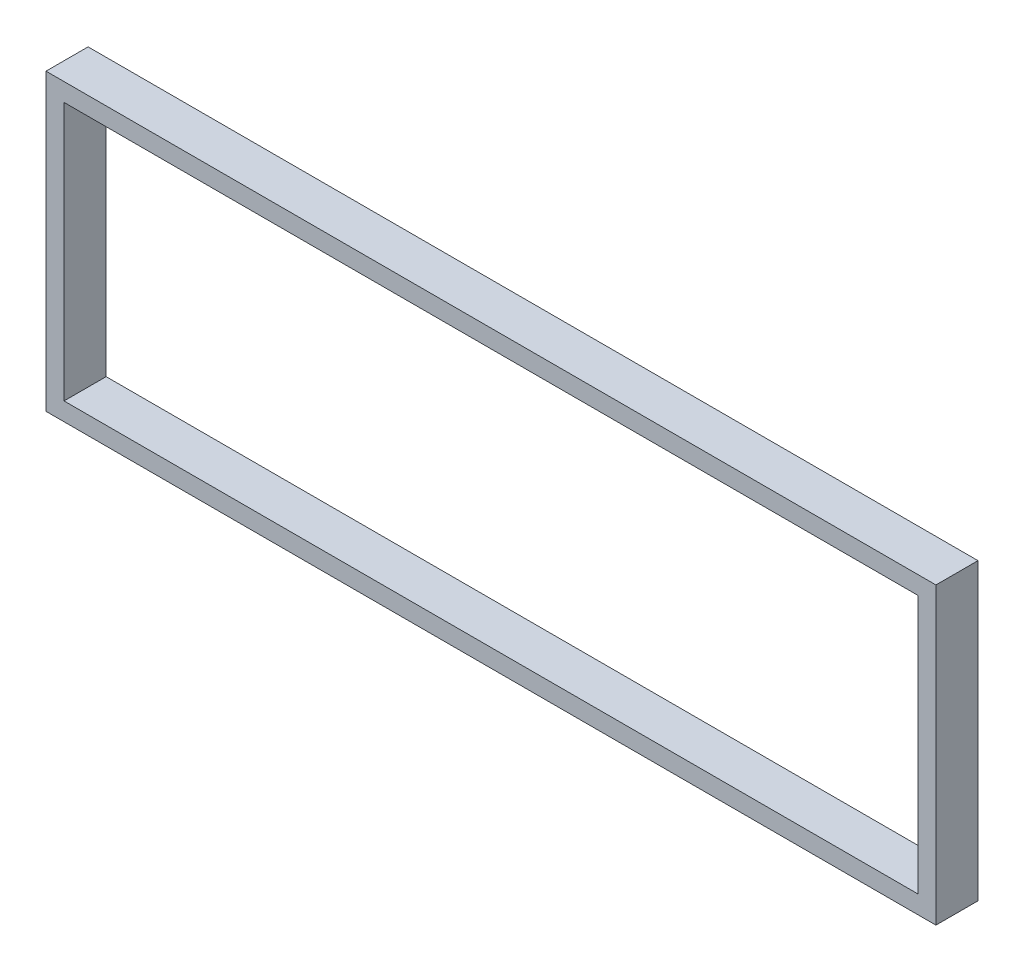
ISO-10303-21;
HEADER;
FILE_DESCRIPTION(('STEP AP214'),'2;1');
FILE_NAME('part.step','',(''),(''),'','','');
FILE_SCHEMA(('AUTOMOTIVE_DESIGN { 1 0 10303 214 1 1 1 1 }'));
ENDSEC;
DATA;
#1=APPLICATION_CONTEXT('core data for automotive mechanical design processes');
#2=APPLICATION_PROTOCOL_DEFINITION('international standard','automotive_design',2000,#1);
#3=PRODUCT_CONTEXT('',#1,'mechanical');
#4=PRODUCT('Part','Part','',(#3));
#5=PRODUCT_RELATED_PRODUCT_CATEGORY('part','',(#4));
#6=PRODUCT_DEFINITION_FORMATION('','',#4);
#7=PRODUCT_DEFINITION_CONTEXT('part definition',#1,'design');
#8=PRODUCT_DEFINITION('design','',#6,#7);
#9=PRODUCT_DEFINITION_SHAPE('','',#8);
#10=(LENGTH_UNIT() NAMED_UNIT(*) SI_UNIT(.MILLI.,.METRE.));
#11=(NAMED_UNIT(*) PLANE_ANGLE_UNIT() SI_UNIT($,.RADIAN.));
#12=(NAMED_UNIT(*) SI_UNIT($,.STERADIAN.) SOLID_ANGLE_UNIT());
#13=UNCERTAINTY_MEASURE_WITH_UNIT(LENGTH_MEASURE(1.E-05),#10,'distance_accuracy_value','');
#14=(GEOMETRIC_REPRESENTATION_CONTEXT(3) GLOBAL_UNCERTAINTY_ASSIGNED_CONTEXT((#13)) GLOBAL_UNIT_ASSIGNED_CONTEXT((#10,
#11,#12)) REPRESENTATION_CONTEXT('',''));
#15=CARTESIAN_POINT('',(0.,0.,0.));
#16=DIRECTION('',(0.,0.,1.));
#17=DIRECTION('',(1.,0.,0.));
#18=AXIS2_PLACEMENT_3D('',#15,#16,#17);
#19=CARTESIAN_POINT('',(0.,0.,7.));
#20=DIRECTION('',(0.,0.,-1.));
#21=DIRECTION('',(-1.,0.,0.));
#22=AXIS2_PLACEMENT_3D('',#19,#20,#21);
#23=PLANE('',#22);
#24=DIRECTION('',(0.,-1.,0.));
#25=VECTOR('',#24,1.);
#26=CARTESIAN_POINT('',(0.,0.,7.));
#27=LINE('',#26,#25);
#28=CARTESIAN_POINT('',(0.,49.,7.));
#29=VERTEX_POINT('',#28);
#30=CARTESIAN_POINT('',(0.,0.,7.));
#31=VERTEX_POINT('',#30);
#32=EDGE_CURVE('E139',#29,#31,#27,.T.);
#33=ORIENTED_EDGE('',*,*,#32,.T.);
#34=DIRECTION('',(1.,0.,0.));
#35=VECTOR('',#34,1.);
#36=CARTESIAN_POINT('',(0.,0.,7.));
#37=LINE('',#36,#35);
#38=CARTESIAN_POINT('',(148.,0.,7.));
#39=VERTEX_POINT('',#38);
#40=EDGE_CURVE('E142',#31,#39,#37,.T.);
#41=ORIENTED_EDGE('',*,*,#40,.T.);
#42=DIRECTION('',(0.,1.,0.));
#43=VECTOR('',#42,1.);
#44=CARTESIAN_POINT('',(148.,0.,7.));
#45=LINE('',#44,#43);
#46=CARTESIAN_POINT('',(148.,49.,7.));
#47=VERTEX_POINT('',#46);
#48=EDGE_CURVE('E147',#39,#47,#45,.T.);
#49=ORIENTED_EDGE('',*,*,#48,.T.);
#50=DIRECTION('',(-1.,0.,0.));
#51=VECTOR('',#50,1.);
#52=CARTESIAN_POINT('',(0.,49.,7.));
#53=LINE('',#52,#51);
#54=EDGE_CURVE('E149',#47,#29,#53,.T.);
#55=ORIENTED_EDGE('',*,*,#54,.T.);
#56=EDGE_LOOP('',(#33,#41,#49,#55));
#57=FACE_BOUND('',#56,.T.);
#58=DIRECTION('',(0.,-1.,0.));
#59=VECTOR('',#58,1.);
#60=CARTESIAN_POINT('',(3.,3.,7.));
#61=LINE('',#60,#59);
#62=CARTESIAN_POINT('',(3.,46.,7.));
#63=VERTEX_POINT('',#62);
#64=CARTESIAN_POINT('',(3.,3.,7.));
#65=VERTEX_POINT('',#64);
#66=EDGE_CURVE('E101',#63,#65,#61,.T.);
#67=ORIENTED_EDGE('',*,*,#66,.F.);
#68=DIRECTION('',(-1.,0.,0.));
#69=VECTOR('',#68,1.);
#70=CARTESIAN_POINT('',(3.,46.,7.));
#71=LINE('',#70,#69);
#72=CARTESIAN_POINT('',(145.,46.,7.));
#73=VERTEX_POINT('',#72);
#74=EDGE_CURVE('E128',#73,#63,#71,.T.);
#75=ORIENTED_EDGE('',*,*,#74,.F.);
#76=DIRECTION('',(0.,1.,0.));
#77=VECTOR('',#76,1.);
#78=CARTESIAN_POINT('',(145.,3.,7.));
#79=LINE('',#78,#77);
#80=CARTESIAN_POINT('',(145.,3.,7.));
#81=VERTEX_POINT('',#80);
#82=EDGE_CURVE('E125',#81,#73,#79,.T.);
#83=ORIENTED_EDGE('',*,*,#82,.F.);
#84=DIRECTION('',(1.,0.,0.));
#85=VECTOR('',#84,1.);
#86=CARTESIAN_POINT('',(3.,3.,7.));
#87=LINE('',#86,#85);
#88=EDGE_CURVE('E115',#65,#81,#87,.T.);
#89=ORIENTED_EDGE('',*,*,#88,.F.);
#90=EDGE_LOOP('',(#67,#75,#83,#89));
#91=FACE_BOUND('',#90,.T.);
#92=ADVANCED_FACE('F39',(#57,#91),#23,.F.);
#93=CARTESIAN_POINT('',(0.,0.,0.));
#94=DIRECTION('',(0.,0.,-1.));
#95=DIRECTION('',(-1.,0.,0.));
#96=AXIS2_PLACEMENT_3D('',#93,#94,#95);
#97=PLANE('',#96);
#98=DIRECTION('',(0.,-1.,0.));
#99=VECTOR('',#98,1.);
#100=CARTESIAN_POINT('',(0.,0.,0.));
#101=LINE('',#100,#99);
#102=CARTESIAN_POINT('',(0.,49.,0.));
#103=VERTEX_POINT('',#102);
#104=CARTESIAN_POINT('',(0.,0.,0.));
#105=VERTEX_POINT('',#104);
#106=EDGE_CURVE('E120',#103,#105,#101,.T.);
#107=ORIENTED_EDGE('',*,*,#106,.F.);
#108=DIRECTION('',(-1.,0.,0.));
#109=VECTOR('',#108,1.);
#110=CARTESIAN_POINT('',(0.,49.,0.));
#111=LINE('',#110,#109);
#112=CARTESIAN_POINT('',(148.,49.,0.));
#113=VERTEX_POINT('',#112);
#114=EDGE_CURVE('E143',#113,#103,#111,.T.);
#115=ORIENTED_EDGE('',*,*,#114,.F.);
#116=DIRECTION('',(0.,1.,0.));
#117=VECTOR('',#116,1.);
#118=CARTESIAN_POINT('',(148.,0.,0.));
#119=LINE('',#118,#117);
#120=CARTESIAN_POINT('',(148.,0.,0.));
#121=VERTEX_POINT('',#120);
#122=EDGE_CURVE('E155',#121,#113,#119,.T.);
#123=ORIENTED_EDGE('',*,*,#122,.F.);
#124=DIRECTION('',(1.,0.,0.));
#125=VECTOR('',#124,1.);
#126=CARTESIAN_POINT('',(0.,0.,0.));
#127=LINE('',#126,#125);
#128=EDGE_CURVE('E154',#105,#121,#127,.T.);
#129=ORIENTED_EDGE('',*,*,#128,.F.);
#130=EDGE_LOOP('',(#107,#115,#123,#129));
#131=FACE_BOUND('',#130,.T.);
#132=DIRECTION('',(-1.,0.,0.));
#133=VECTOR('',#132,1.);
#134=CARTESIAN_POINT('',(3.,46.,0.));
#135=LINE('',#134,#133);
#136=CARTESIAN_POINT('',(145.,46.,0.));
#137=VERTEX_POINT('',#136);
#138=CARTESIAN_POINT('',(3.,46.,0.));
#139=VERTEX_POINT('',#138);
#140=EDGE_CURVE('E111',#137,#139,#135,.T.);
#141=ORIENTED_EDGE('',*,*,#140,.T.);
#142=DIRECTION('',(0.,-1.,0.));
#143=VECTOR('',#142,1.);
#144=CARTESIAN_POINT('',(3.,3.,0.));
#145=LINE('',#144,#143);
#146=CARTESIAN_POINT('',(3.,3.,0.));
#147=VERTEX_POINT('',#146);
#148=EDGE_CURVE('E62',#139,#147,#145,.T.);
#149=ORIENTED_EDGE('',*,*,#148,.T.);
#150=DIRECTION('',(1.,0.,0.));
#151=VECTOR('',#150,1.);
#152=CARTESIAN_POINT('',(3.,3.,0.));
#153=LINE('',#152,#151);
#154=CARTESIAN_POINT('',(145.,3.,0.));
#155=VERTEX_POINT('',#154);
#156=EDGE_CURVE('E118',#147,#155,#153,.T.);
#157=ORIENTED_EDGE('',*,*,#156,.T.);
#158=DIRECTION('',(0.,1.,0.));
#159=VECTOR('',#158,1.);
#160=CARTESIAN_POINT('',(145.,3.,0.));
#161=LINE('',#160,#159);
#162=EDGE_CURVE('E135',#155,#137,#161,.T.);
#163=ORIENTED_EDGE('',*,*,#162,.T.);
#164=EDGE_LOOP('',(#141,#149,#157,#163));
#165=FACE_BOUND('',#164,.T.);
#166=ADVANCED_FACE('F171',(#131,#165),#97,.T.);
#167=CARTESIAN_POINT('',(0.,0.,7.));
#168=DIRECTION('',(1.,0.,0.));
#169=DIRECTION('',(0.,0.,-1.));
#170=AXIS2_PLACEMENT_3D('',#167,#168,#169);
#171=PLANE('',#170);
#172=ORIENTED_EDGE('',*,*,#106,.T.);
#173=DIRECTION('',(0.,0.,-1.));
#174=VECTOR('',#173,1.);
#175=CARTESIAN_POINT('',(0.,0.,7.));
#176=LINE('',#175,#174);
#177=EDGE_CURVE('E11',#31,#105,#176,.T.);
#178=ORIENTED_EDGE('',*,*,#177,.F.);
#179=ORIENTED_EDGE('',*,*,#32,.F.);
#180=DIRECTION('',(0.,0.,-1.));
#181=VECTOR('',#180,1.);
#182=CARTESIAN_POINT('',(0.,49.,7.));
#183=LINE('',#182,#181);
#184=EDGE_CURVE('E148',#29,#103,#183,.T.);
#185=ORIENTED_EDGE('',*,*,#184,.T.);
#186=EDGE_LOOP('',(#172,#178,#179,#185));
#187=FACE_BOUND('',#186,.T.);
#188=ADVANCED_FACE('F41',(#187),#171,.F.);
#189=CARTESIAN_POINT('',(0.,0.,7.));
#190=DIRECTION('',(0.,1.,0.));
#191=DIRECTION('',(0.,0.,1.));
#192=AXIS2_PLACEMENT_3D('',#189,#190,#191);
#193=PLANE('',#192);
#194=ORIENTED_EDGE('',*,*,#128,.T.);
#195=DIRECTION('',(0.,0.,-1.));
#196=VECTOR('',#195,1.);
#197=CARTESIAN_POINT('',(148.,0.,7.));
#198=LINE('',#197,#196);
#199=EDGE_CURVE('E50',#39,#121,#198,.T.);
#200=ORIENTED_EDGE('',*,*,#199,.F.);
#201=ORIENTED_EDGE('',*,*,#40,.F.);
#202=ORIENTED_EDGE('',*,*,#177,.T.);
#203=EDGE_LOOP('',(#194,#200,#201,#202));
#204=FACE_BOUND('',#203,.T.);
#205=ADVANCED_FACE('F183',(#204),#193,.F.);
#206=CARTESIAN_POINT('',(148.,0.,7.));
#207=DIRECTION('',(-1.,0.,0.));
#208=DIRECTION('',(0.,0.,1.));
#209=AXIS2_PLACEMENT_3D('',#206,#207,#208);
#210=PLANE('',#209);
#211=ORIENTED_EDGE('',*,*,#122,.T.);
#212=DIRECTION('',(0.,0.,-1.));
#213=VECTOR('',#212,1.);
#214=CARTESIAN_POINT('',(148.,49.,7.));
#215=LINE('',#214,#213);
#216=EDGE_CURVE('E158',#47,#113,#215,.T.);
#217=ORIENTED_EDGE('',*,*,#216,.F.);
#218=ORIENTED_EDGE('',*,*,#48,.F.);
#219=ORIENTED_EDGE('',*,*,#199,.T.);
#220=EDGE_LOOP('',(#211,#217,#218,#219));
#221=FACE_BOUND('',#220,.T.);
#222=ADVANCED_FACE('F167',(#221),#210,.F.);
#223=CARTESIAN_POINT('',(0.,49.,7.));
#224=DIRECTION('',(0.,-1.,0.));
#225=DIRECTION('',(0.,0.,-1.));
#226=AXIS2_PLACEMENT_3D('',#223,#224,#225);
#227=PLANE('',#226);
#228=ORIENTED_EDGE('',*,*,#114,.T.);
#229=ORIENTED_EDGE('',*,*,#184,.F.);
#230=ORIENTED_EDGE('',*,*,#54,.F.);
#231=ORIENTED_EDGE('',*,*,#216,.T.);
#232=EDGE_LOOP('',(#228,#229,#230,#231));
#233=FACE_BOUND('',#232,.T.);
#234=ADVANCED_FACE('F180',(#233),#227,.F.);
#235=CARTESIAN_POINT('',(3.,3.,7.));
#236=DIRECTION('',(1.,0.,0.));
#237=DIRECTION('',(0.,0.,-1.));
#238=AXIS2_PLACEMENT_3D('',#235,#236,#237);
#239=PLANE('',#238);
#240=ORIENTED_EDGE('',*,*,#148,.F.);
#241=DIRECTION('',(0.,0.,-1.));
#242=VECTOR('',#241,1.);
#243=CARTESIAN_POINT('',(3.,46.,7.));
#244=LINE('',#243,#242);
#245=EDGE_CURVE('E109',#63,#139,#244,.T.);
#246=ORIENTED_EDGE('',*,*,#245,.F.);
#247=ORIENTED_EDGE('',*,*,#66,.T.);
#248=DIRECTION('',(0.,0.,-1.));
#249=VECTOR('',#248,1.);
#250=CARTESIAN_POINT('',(3.,3.,7.));
#251=LINE('',#250,#249);
#252=EDGE_CURVE('E107',#65,#147,#251,.T.);
#253=ORIENTED_EDGE('',*,*,#252,.T.);
#254=EDGE_LOOP('',(#240,#246,#247,#253));
#255=FACE_BOUND('',#254,.T.);
#256=ADVANCED_FACE('F106',(#255),#239,.T.);
#257=CARTESIAN_POINT('',(3.,3.,7.));
#258=DIRECTION('',(0.,1.,0.));
#259=DIRECTION('',(0.,0.,1.));
#260=AXIS2_PLACEMENT_3D('',#257,#258,#259);
#261=PLANE('',#260);
#262=ORIENTED_EDGE('',*,*,#156,.F.);
#263=ORIENTED_EDGE('',*,*,#252,.F.);
#264=ORIENTED_EDGE('',*,*,#88,.T.);
#265=DIRECTION('',(0.,0.,-1.));
#266=VECTOR('',#265,1.);
#267=CARTESIAN_POINT('',(145.,3.,7.));
#268=LINE('',#267,#266);
#269=EDGE_CURVE('E123',#81,#155,#268,.T.);
#270=ORIENTED_EDGE('',*,*,#269,.T.);
#271=EDGE_LOOP('',(#262,#263,#264,#270));
#272=FACE_BOUND('',#271,.T.);
#273=ADVANCED_FACE('F116',(#272),#261,.T.);
#274=CARTESIAN_POINT('',(145.,3.,7.));
#275=DIRECTION('',(-1.,0.,0.));
#276=DIRECTION('',(0.,0.,1.));
#277=AXIS2_PLACEMENT_3D('',#274,#275,#276);
#278=PLANE('',#277);
#279=ORIENTED_EDGE('',*,*,#162,.F.);
#280=ORIENTED_EDGE('',*,*,#269,.F.);
#281=ORIENTED_EDGE('',*,*,#82,.T.);
#282=DIRECTION('',(0.,0.,-1.));
#283=VECTOR('',#282,1.);
#284=CARTESIAN_POINT('',(145.,46.,7.));
#285=LINE('',#284,#283);
#286=EDGE_CURVE('E53',#73,#137,#285,.T.);
#287=ORIENTED_EDGE('',*,*,#286,.T.);
#288=EDGE_LOOP('',(#279,#280,#281,#287));
#289=FACE_BOUND('',#288,.T.);
#290=ADVANCED_FACE('F206',(#289),#278,.T.);
#291=CARTESIAN_POINT('',(3.,46.,7.));
#292=DIRECTION('',(0.,-1.,0.));
#293=DIRECTION('',(0.,0.,-1.));
#294=AXIS2_PLACEMENT_3D('',#291,#292,#293);
#295=PLANE('',#294);
#296=ORIENTED_EDGE('',*,*,#140,.F.);
#297=ORIENTED_EDGE('',*,*,#286,.F.);
#298=ORIENTED_EDGE('',*,*,#74,.T.);
#299=ORIENTED_EDGE('',*,*,#245,.T.);
#300=EDGE_LOOP('',(#296,#297,#298,#299));
#301=FACE_BOUND('',#300,.T.);
#302=ADVANCED_FACE('F210',(#301),#295,.T.);
#303=CLOSED_SHELL('',(#92,#166,#188,#205,#222,#234,#256,#273,#290,#302));
#304=MANIFOLD_SOLID_BREP('B2',#303);
#305=ADVANCED_BREP_SHAPE_REPRESENTATION('',(#18,#304),#14);
#306=SHAPE_DEFINITION_REPRESENTATION(#9,#305);
ENDSEC;
END-ISO-10303-21;
